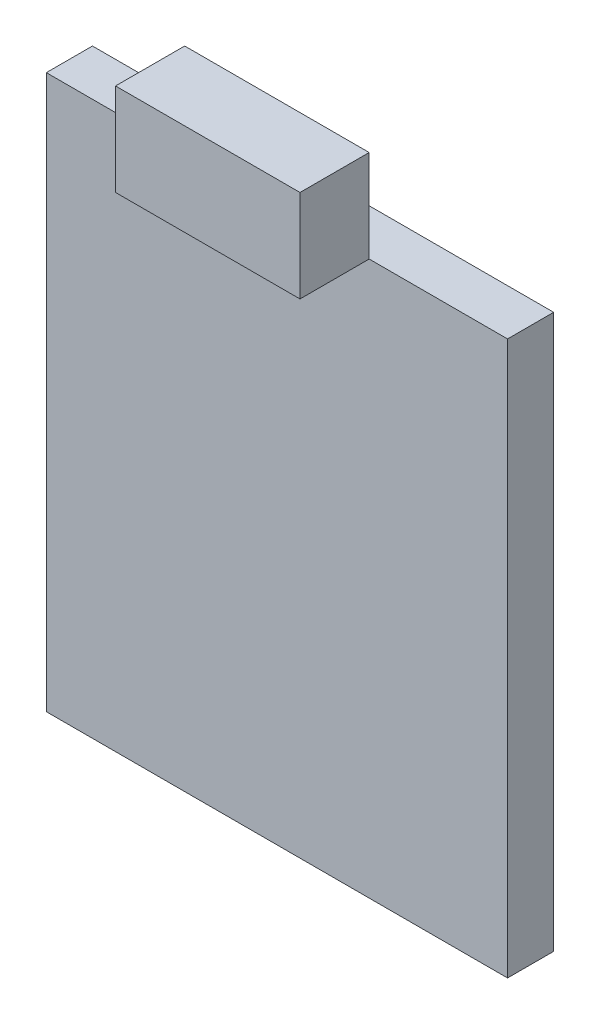
ISO-10303-21;
HEADER;
FILE_DESCRIPTION(('STEP AP214'),'2;1');
FILE_NAME('part.step','',(''),(''),'','','');
FILE_SCHEMA(('AUTOMOTIVE_DESIGN { 1 0 10303 214 1 1 1 1 }'));
ENDSEC;
DATA;
#1=APPLICATION_CONTEXT('core data for automotive mechanical design processes');
#2=APPLICATION_PROTOCOL_DEFINITION('international standard','automotive_design',2000,#1);
#3=PRODUCT_CONTEXT('',#1,'mechanical');
#4=PRODUCT('Part','Part','',(#3));
#5=PRODUCT_RELATED_PRODUCT_CATEGORY('part','',(#4));
#6=PRODUCT_DEFINITION_FORMATION('','',#4);
#7=PRODUCT_DEFINITION_CONTEXT('part definition',#1,'design');
#8=PRODUCT_DEFINITION('design','',#6,#7);
#9=PRODUCT_DEFINITION_SHAPE('','',#8);
#10=(LENGTH_UNIT() NAMED_UNIT(*) SI_UNIT(.MILLI.,.METRE.));
#11=(NAMED_UNIT(*) PLANE_ANGLE_UNIT() SI_UNIT($,.RADIAN.));
#12=(NAMED_UNIT(*) SI_UNIT($,.STERADIAN.) SOLID_ANGLE_UNIT());
#13=UNCERTAINTY_MEASURE_WITH_UNIT(LENGTH_MEASURE(1.E-05),#10,'distance_accuracy_value','');
#14=(GEOMETRIC_REPRESENTATION_CONTEXT(3) GLOBAL_UNCERTAINTY_ASSIGNED_CONTEXT((#13)) GLOBAL_UNIT_ASSIGNED_CONTEXT((#10,
#11,#12)) REPRESENTATION_CONTEXT('',''));
#15=CARTESIAN_POINT('',(0.,0.,0.));
#16=DIRECTION('',(0.,0.,1.));
#17=DIRECTION('',(1.,0.,0.));
#18=AXIS2_PLACEMENT_3D('',#15,#16,#17);
#19=CARTESIAN_POINT('',(-3.175,12.7,3.96875));
#20=DIRECTION('',(1.,0.,0.));
#21=DIRECTION('',(0.,1.,0.));
#22=AXIS2_PLACEMENT_3D('',#19,#20,#21);
#23=PLANE('',#22);
#24=DIRECTION('',(0.,-1.,0.));
#25=VECTOR('',#24,1.);
#26=CARTESIAN_POINT('',(-3.175,12.7,1.5875));
#27=LINE('',#26,#25);
#28=CARTESIAN_POINT('',(-3.175,12.7,1.5875));
#29=VERTEX_POINT('',#28);
#30=CARTESIAN_POINT('',(-3.175,9.525,1.5875));
#31=VERTEX_POINT('',#30);
#32=EDGE_CURVE('E106',#29,#31,#27,.T.);
#33=ORIENTED_EDGE('',*,*,#32,.T.);
#34=DIRECTION('',(0.,0.,-1.));
#35=VECTOR('',#34,1.);
#36=CARTESIAN_POINT('',(-3.175,9.525,3.96875));
#37=LINE('',#36,#35);
#38=CARTESIAN_POINT('',(-3.175,9.525,3.96875));
#39=VERTEX_POINT('',#38);
#40=EDGE_CURVE('E12',#39,#31,#37,.T.);
#41=ORIENTED_EDGE('',*,*,#40,.F.);
#42=DIRECTION('',(0.,-1.,0.));
#43=VECTOR('',#42,1.);
#44=CARTESIAN_POINT('',(-3.175,12.7,3.96875));
#45=LINE('',#44,#43);
#46=CARTESIAN_POINT('',(-3.175,12.7,3.96875));
#47=VERTEX_POINT('',#46);
#48=EDGE_CURVE('E94',#47,#39,#45,.T.);
#49=ORIENTED_EDGE('',*,*,#48,.F.);
#50=DIRECTION('',(0.,0.,-1.));
#51=VECTOR('',#50,1.);
#52=CARTESIAN_POINT('',(-3.175,12.7,3.96875));
#53=LINE('',#52,#51);
#54=EDGE_CURVE('E102',#47,#29,#53,.T.);
#55=ORIENTED_EDGE('',*,*,#54,.T.);
#56=EDGE_LOOP('',(#33,#41,#49,#55));
#57=FACE_BOUND('',#56,.T.);
#58=ADVANCED_FACE('F43',(#57),#23,.F.);
#59=CARTESIAN_POINT('',(3.175,9.525,3.96875));
#60=DIRECTION('',(0.,1.,0.));
#61=DIRECTION('',(0.,0.,1.));
#62=AXIS2_PLACEMENT_3D('',#59,#60,#61);
#63=PLANE('',#62);
#64=DIRECTION('',(1.,0.,0.));
#65=VECTOR('',#64,1.);
#66=CARTESIAN_POINT('',(3.175,9.525,1.5875));
#67=LINE('',#66,#65);
#68=CARTESIAN_POINT('',(3.175,9.525,1.5875));
#69=VERTEX_POINT('',#68);
#70=EDGE_CURVE('E98',#31,#69,#67,.T.);
#71=ORIENTED_EDGE('',*,*,#70,.T.);
#72=DIRECTION('',(0.,0.,-1.));
#73=VECTOR('',#72,1.);
#74=CARTESIAN_POINT('',(3.175,9.525,3.96875));
#75=LINE('',#74,#73);
#76=CARTESIAN_POINT('',(3.175,9.525,3.96875));
#77=VERTEX_POINT('',#76);
#78=EDGE_CURVE('E51',#77,#69,#75,.T.);
#79=ORIENTED_EDGE('',*,*,#78,.F.);
#80=DIRECTION('',(1.,0.,0.));
#81=VECTOR('',#80,1.);
#82=CARTESIAN_POINT('',(3.175,9.525,3.96875));
#83=LINE('',#82,#81);
#84=EDGE_CURVE('E89',#39,#77,#83,.T.);
#85=ORIENTED_EDGE('',*,*,#84,.F.);
#86=ORIENTED_EDGE('',*,*,#40,.T.);
#87=EDGE_LOOP('',(#71,#79,#85,#86));
#88=FACE_BOUND('',#87,.T.);
#89=ADVANCED_FACE('F97',(#88),#63,.F.);
#90=CARTESIAN_POINT('',(3.175,12.7,3.96875));
#91=DIRECTION('',(-1.,0.,0.));
#92=DIRECTION('',(0.,-1.,0.));
#93=AXIS2_PLACEMENT_3D('',#90,#91,#92);
#94=PLANE('',#93);
#95=DIRECTION('',(0.,1.,0.));
#96=VECTOR('',#95,1.);
#97=CARTESIAN_POINT('',(3.175,12.7,1.5875));
#98=LINE('',#97,#96);
#99=CARTESIAN_POINT('',(3.175,12.7,1.5875));
#100=VERTEX_POINT('',#99);
#101=EDGE_CURVE('E76',#69,#100,#98,.T.);
#102=ORIENTED_EDGE('',*,*,#101,.T.);
#103=DIRECTION('',(0.,0.,-1.));
#104=VECTOR('',#103,1.);
#105=CARTESIAN_POINT('',(3.175,12.7,3.96875));
#106=LINE('',#105,#104);
#107=CARTESIAN_POINT('',(3.175,12.7,3.96875));
#108=VERTEX_POINT('',#107);
#109=EDGE_CURVE('E99',#108,#100,#106,.T.);
#110=ORIENTED_EDGE('',*,*,#109,.F.);
#111=DIRECTION('',(0.,1.,0.));
#112=VECTOR('',#111,1.);
#113=CARTESIAN_POINT('',(3.175,12.7,3.96875));
#114=LINE('',#113,#112);
#115=EDGE_CURVE('E92',#77,#108,#114,.T.);
#116=ORIENTED_EDGE('',*,*,#115,.F.);
#117=ORIENTED_EDGE('',*,*,#78,.T.);
#118=EDGE_LOOP('',(#102,#110,#116,#117));
#119=FACE_BOUND('',#118,.T.);
#120=ADVANCED_FACE('F100',(#119),#94,.F.);
#121=CARTESIAN_POINT('',(3.175,12.7,3.96875));
#122=DIRECTION('',(0.,-1.,0.));
#123=DIRECTION('',(0.,0.,-1.));
#124=AXIS2_PLACEMENT_3D('',#121,#122,#123);
#125=PLANE('',#124);
#126=DIRECTION('',(-1.,0.,0.));
#127=VECTOR('',#126,1.);
#128=CARTESIAN_POINT('',(3.175,12.7,1.5875));
#129=LINE('',#128,#127);
#130=EDGE_CURVE('E82',#100,#29,#129,.T.);
#131=ORIENTED_EDGE('',*,*,#130,.T.);
#132=ORIENTED_EDGE('',*,*,#54,.F.);
#133=DIRECTION('',(-1.,0.,0.));
#134=VECTOR('',#133,1.);
#135=CARTESIAN_POINT('',(3.175,12.7,3.96875));
#136=LINE('',#135,#134);
#137=EDGE_CURVE('E59',#108,#47,#136,.T.);
#138=ORIENTED_EDGE('',*,*,#137,.F.);
#139=ORIENTED_EDGE('',*,*,#109,.T.);
#140=EDGE_LOOP('',(#131,#132,#138,#139));
#141=FACE_BOUND('',#140,.T.);
#142=ADVANCED_FACE('F113',(#141),#125,.F.);
#143=CARTESIAN_POINT('',(0.,0.,3.96875));
#144=DIRECTION('',(0.,0.,-1.));
#145=DIRECTION('',(-1.,0.,0.));
#146=AXIS2_PLACEMENT_3D('',#143,#144,#145);
#147=PLANE('',#146);
#148=ORIENTED_EDGE('',*,*,#48,.T.);
#149=ORIENTED_EDGE('',*,*,#84,.T.);
#150=ORIENTED_EDGE('',*,*,#115,.T.);
#151=ORIENTED_EDGE('',*,*,#137,.T.);
#152=EDGE_LOOP('',(#148,#149,#150,#151));
#153=FACE_BOUND('',#152,.T.);
#154=ADVANCED_FACE('F90',(#153),#147,.F.);
#155=CARTESIAN_POINT('',(0.,0.,1.5875));
#156=DIRECTION('',(0.,0.,-1.));
#157=DIRECTION('',(-1.,0.,0.));
#158=AXIS2_PLACEMENT_3D('',#155,#156,#157);
#159=PLANE('',#158);
#160=ORIENTED_EDGE('',*,*,#32,.F.);
#161=ORIENTED_EDGE('',*,*,#130,.F.);
#162=ORIENTED_EDGE('',*,*,#101,.F.);
#163=ORIENTED_EDGE('',*,*,#70,.F.);
#164=EDGE_LOOP('',(#160,#161,#162,#163));
#165=FACE_BOUND('',#164,.T.);
#166=ADVANCED_FACE('F116',(#165),#159,.T.);
#167=CLOSED_SHELL('',(#58,#89,#120,#142,#154,#166));
#168=MANIFOLD_SOLID_BREP('B2',#167);
#169=CARTESIAN_POINT('',(7.9375,-9.525,1.5875));
#170=DIRECTION('',(-1.,0.,0.));
#171=DIRECTION('',(0.,0.,1.));
#172=AXIS2_PLACEMENT_3D('',#169,#170,#171);
#173=PLANE('',#172);
#174=DIRECTION('',(0.,1.,0.));
#175=VECTOR('',#174,1.);
#176=CARTESIAN_POINT('',(7.9375,-9.525,0.));
#177=LINE('',#176,#175);
#178=CARTESIAN_POINT('',(7.9375,-9.525,0.));
#179=VERTEX_POINT('',#178);
#180=CARTESIAN_POINT('',(7.9375,9.525,0.));
#181=VERTEX_POINT('',#180);
#182=EDGE_CURVE('E230',#179,#181,#177,.T.);
#183=ORIENTED_EDGE('',*,*,#182,.T.);
#184=DIRECTION('',(0.,0.,-1.));
#185=VECTOR('',#184,1.);
#186=CARTESIAN_POINT('',(7.9375,9.525,1.5875));
#187=LINE('',#186,#185);
#188=CARTESIAN_POINT('',(7.9375,9.525,1.5875));
#189=VERTEX_POINT('',#188);
#190=EDGE_CURVE('E41',#189,#181,#187,.T.);
#191=ORIENTED_EDGE('',*,*,#190,.F.);
#192=DIRECTION('',(0.,1.,0.));
#193=VECTOR('',#192,1.);
#194=CARTESIAN_POINT('',(7.9375,-9.525,1.5875));
#195=LINE('',#194,#193);
#196=CARTESIAN_POINT('',(7.9375,-9.525,1.5875));
#197=VERTEX_POINT('',#196);
#198=EDGE_CURVE('E218',#197,#189,#195,.T.);
#199=ORIENTED_EDGE('',*,*,#198,.F.);
#200=DIRECTION('',(0.,0.,-1.));
#201=VECTOR('',#200,1.);
#202=CARTESIAN_POINT('',(7.9375,-9.525,1.5875));
#203=LINE('',#202,#201);
#204=EDGE_CURVE('E226',#197,#179,#203,.T.);
#205=ORIENTED_EDGE('',*,*,#204,.T.);
#206=EDGE_LOOP('',(#183,#191,#199,#205));
#207=FACE_BOUND('',#206,.T.);
#208=ADVANCED_FACE('F167',(#207),#173,.F.);
#209=CARTESIAN_POINT('',(-7.9375,9.525,1.5875));
#210=DIRECTION('',(0.,-1.,0.));
#211=DIRECTION('',(0.,0.,-1.));
#212=AXIS2_PLACEMENT_3D('',#209,#210,#211);
#213=PLANE('',#212);
#214=DIRECTION('',(-1.,0.,0.));
#215=VECTOR('',#214,1.);
#216=CARTESIAN_POINT('',(-7.9375,9.525,0.));
#217=LINE('',#216,#215);
#218=CARTESIAN_POINT('',(-7.9375,9.525,0.));
#219=VERTEX_POINT('',#218);
#220=EDGE_CURVE('E222',#181,#219,#217,.T.);
#221=ORIENTED_EDGE('',*,*,#220,.T.);
#222=DIRECTION('',(0.,0.,-1.));
#223=VECTOR('',#222,1.);
#224=CARTESIAN_POINT('',(-7.9375,9.525,1.5875));
#225=LINE('',#224,#223);
#226=CARTESIAN_POINT('',(-7.9375,9.525,1.5875));
#227=VERTEX_POINT('',#226);
#228=EDGE_CURVE('E175',#227,#219,#225,.T.);
#229=ORIENTED_EDGE('',*,*,#228,.F.);
#230=DIRECTION('',(-1.,0.,0.));
#231=VECTOR('',#230,1.);
#232=CARTESIAN_POINT('',(-7.9375,9.525,1.5875));
#233=LINE('',#232,#231);
#234=EDGE_CURVE('E213',#189,#227,#233,.T.);
#235=ORIENTED_EDGE('',*,*,#234,.F.);
#236=ORIENTED_EDGE('',*,*,#190,.T.);
#237=EDGE_LOOP('',(#221,#229,#235,#236));
#238=FACE_BOUND('',#237,.T.);
#239=ADVANCED_FACE('F221',(#238),#213,.F.);
#240=CARTESIAN_POINT('',(-7.9375,-9.525,1.5875));
#241=DIRECTION('',(1.,0.,0.));
#242=DIRECTION('',(0.,0.,-1.));
#243=AXIS2_PLACEMENT_3D('',#240,#241,#242);
#244=PLANE('',#243);
#245=DIRECTION('',(0.,-1.,0.));
#246=VECTOR('',#245,1.);
#247=CARTESIAN_POINT('',(-7.9375,-9.525,0.));
#248=LINE('',#247,#246);
#249=CARTESIAN_POINT('',(-7.9375,-9.525,0.));
#250=VERTEX_POINT('',#249);
#251=EDGE_CURVE('E200',#219,#250,#248,.T.);
#252=ORIENTED_EDGE('',*,*,#251,.T.);
#253=DIRECTION('',(0.,0.,-1.));
#254=VECTOR('',#253,1.);
#255=CARTESIAN_POINT('',(-7.9375,-9.525,1.5875));
#256=LINE('',#255,#254);
#257=CARTESIAN_POINT('',(-7.9375,-9.525,1.5875));
#258=VERTEX_POINT('',#257);
#259=EDGE_CURVE('E223',#258,#250,#256,.T.);
#260=ORIENTED_EDGE('',*,*,#259,.F.);
#261=DIRECTION('',(0.,-1.,0.));
#262=VECTOR('',#261,1.);
#263=CARTESIAN_POINT('',(-7.9375,-9.525,1.5875));
#264=LINE('',#263,#262);
#265=EDGE_CURVE('E216',#227,#258,#264,.T.);
#266=ORIENTED_EDGE('',*,*,#265,.F.);
#267=ORIENTED_EDGE('',*,*,#228,.T.);
#268=EDGE_LOOP('',(#252,#260,#266,#267));
#269=FACE_BOUND('',#268,.T.);
#270=ADVANCED_FACE('F224',(#269),#244,.F.);
#271=CARTESIAN_POINT('',(-7.9375,-9.525,1.5875));
#272=DIRECTION('',(0.,1.,0.));
#273=DIRECTION('',(0.,0.,1.));
#274=AXIS2_PLACEMENT_3D('',#271,#272,#273);
#275=PLANE('',#274);
#276=DIRECTION('',(1.,0.,0.));
#277=VECTOR('',#276,1.);
#278=CARTESIAN_POINT('',(-7.9375,-9.525,0.));
#279=LINE('',#278,#277);
#280=EDGE_CURVE('E206',#250,#179,#279,.T.);
#281=ORIENTED_EDGE('',*,*,#280,.T.);
#282=ORIENTED_EDGE('',*,*,#204,.F.);
#283=DIRECTION('',(1.,0.,0.));
#284=VECTOR('',#283,1.);
#285=CARTESIAN_POINT('',(-7.9375,-9.525,1.5875));
#286=LINE('',#285,#284);
#287=EDGE_CURVE('E183',#258,#197,#286,.T.);
#288=ORIENTED_EDGE('',*,*,#287,.F.);
#289=ORIENTED_EDGE('',*,*,#259,.T.);
#290=EDGE_LOOP('',(#281,#282,#288,#289));
#291=FACE_BOUND('',#290,.T.);
#292=ADVANCED_FACE('F237',(#291),#275,.F.);
#293=CARTESIAN_POINT('',(0.,0.,1.5875));
#294=DIRECTION('',(0.,0.,-1.));
#295=DIRECTION('',(-1.,0.,0.));
#296=AXIS2_PLACEMENT_3D('',#293,#294,#295);
#297=PLANE('',#296);
#298=ORIENTED_EDGE('',*,*,#198,.T.);
#299=ORIENTED_EDGE('',*,*,#234,.T.);
#300=ORIENTED_EDGE('',*,*,#265,.T.);
#301=ORIENTED_EDGE('',*,*,#287,.T.);
#302=EDGE_LOOP('',(#298,#299,#300,#301));
#303=FACE_BOUND('',#302,.T.);
#304=ADVANCED_FACE('F214',(#303),#297,.F.);
#305=CARTESIAN_POINT('',(0.,0.,0.));
#306=DIRECTION('',(0.,0.,-1.));
#307=DIRECTION('',(-1.,0.,0.));
#308=AXIS2_PLACEMENT_3D('',#305,#306,#307);
#309=PLANE('',#308);
#310=ORIENTED_EDGE('',*,*,#182,.F.);
#311=ORIENTED_EDGE('',*,*,#280,.F.);
#312=ORIENTED_EDGE('',*,*,#251,.F.);
#313=ORIENTED_EDGE('',*,*,#220,.F.);
#314=EDGE_LOOP('',(#310,#311,#312,#313));
#315=FACE_BOUND('',#314,.T.);
#316=ADVANCED_FACE('F240',(#315),#309,.T.);
#317=CLOSED_SHELL('',(#208,#239,#270,#292,#304,#316));
#318=MANIFOLD_SOLID_BREP('B6',#317);
#319=ADVANCED_BREP_SHAPE_REPRESENTATION('',(#18,#168,#318),#14);
#320=SHAPE_DEFINITION_REPRESENTATION(#9,#319);
ENDSEC;
END-ISO-10303-21;
